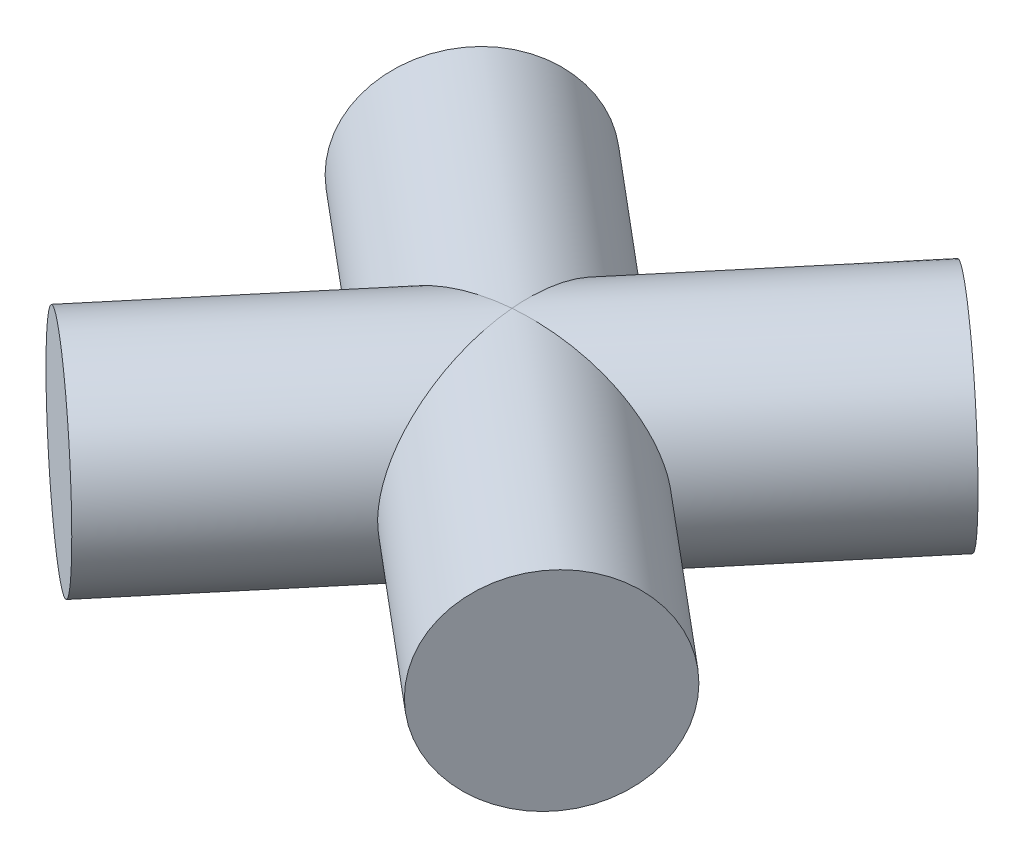
ISO-10303-21;
HEADER;
FILE_DESCRIPTION(('STEP AP214'),'2;1');
FILE_NAME('part.step','',(''),(''),'','','');
FILE_SCHEMA(('AUTOMOTIVE_DESIGN { 1 0 10303 214 1 1 1 1 }'));
ENDSEC;
DATA;
#1=APPLICATION_CONTEXT('core data for automotive mechanical design processes');
#2=APPLICATION_PROTOCOL_DEFINITION('international standard','automotive_design',2000,#1);
#3=PRODUCT_CONTEXT('',#1,'mechanical');
#4=PRODUCT('Part','Part','',(#3));
#5=PRODUCT_RELATED_PRODUCT_CATEGORY('part','',(#4));
#6=PRODUCT_DEFINITION_FORMATION('','',#4);
#7=PRODUCT_DEFINITION_CONTEXT('part definition',#1,'design');
#8=PRODUCT_DEFINITION('design','',#6,#7);
#9=PRODUCT_DEFINITION_SHAPE('','',#8);
#10=(LENGTH_UNIT() NAMED_UNIT(*) SI_UNIT(.MILLI.,.METRE.));
#11=(NAMED_UNIT(*) PLANE_ANGLE_UNIT() SI_UNIT($,.RADIAN.));
#12=(NAMED_UNIT(*) SI_UNIT($,.STERADIAN.) SOLID_ANGLE_UNIT());
#13=UNCERTAINTY_MEASURE_WITH_UNIT(LENGTH_MEASURE(1.E-05),#10,'distance_accuracy_value','');
#14=(GEOMETRIC_REPRESENTATION_CONTEXT(3) GLOBAL_UNCERTAINTY_ASSIGNED_CONTEXT((#13)) GLOBAL_UNIT_ASSIGNED_CONTEXT((#10,
#11,#12)) REPRESENTATION_CONTEXT('',''));
#15=CARTESIAN_POINT('',(0.,0.,0.));
#16=DIRECTION('',(0.,0.,1.));
#17=DIRECTION('',(1.,0.,0.));
#18=AXIS2_PLACEMENT_3D('',#15,#16,#17);
#19=CARTESIAN_POINT('',(-15.3208888623795,253.5,-12.8557521937308));
#20=DIRECTION('',(0.766044443118977,0.,0.64278760968654));
#21=DIRECTION('',(0.64278760968654,0.,-0.766044443118977));
#22=AXIS2_PLACEMENT_3D('',#19,#20,#21);
#23=CYLINDRICAL_SURFACE('',#22,6.5);
#24=CARTESIAN_POINT('',(15.3208888623795,253.5,12.8557521937308));
#25=DIRECTION('',(0.766044443118977,0.,0.64278760968654));
#26=DIRECTION('',(0.64278760968654,0.,-0.766044443118977));
#27=AXIS2_PLACEMENT_3D('',#24,#25,#26);
#28=CIRCLE('',#27,6.5);
#29=CARTESIAN_POINT('',(19.4990083253421,253.5,7.87646331345745));
#30=VERTEX_POINT('',#29);
#31=EDGE_CURVE('E72',#30,#30,#28,.T.);
#32=ORIENTED_EDGE('',*,*,#31,.F.);
#33=EDGE_LOOP('',(#32));
#34=FACE_BOUND('',#33,.T.);
#35=CARTESIAN_POINT('',(0.,253.5,0.));
#36=DIRECTION('',(0.0871557427476569,0.,0.996194698091746));
#37=DIRECTION('',(0.996194698091746,0.,-0.087155742747657));
#38=AXIS2_PLACEMENT_3D('',#35,#36,#37);
#39=ELLIPSE('',#38,9.19238815542512,6.50000000000001);
#40=CARTESIAN_POINT('',(0.,247.,0.));
#41=VERTEX_POINT('',#40);
#42=CARTESIAN_POINT('',(0.,260.,0.));
#43=VERTEX_POINT('',#42);
#44=EDGE_CURVE('E60',#41,#43,#39,.T.);
#45=ORIENTED_EDGE('',*,*,#44,.T.);
#46=CARTESIAN_POINT('',(0.,253.5,0.));
#47=DIRECTION('',(0.996194698091746,0.,-0.087155742747657));
#48=DIRECTION('',(0.0871557427476569,0.,0.996194698091746));
#49=AXIS2_PLACEMENT_3D('',#46,#47,#48);
#50=ELLIPSE('',#49,9.19238815542513,6.50000000000001);
#51=EDGE_CURVE('E49',#43,#41,#50,.T.);
#52=ORIENTED_EDGE('',*,*,#51,.T.);
#53=EDGE_LOOP('',(#45,#52));
#54=FACE_BOUND('',#53,.T.);
#55=ADVANCED_FACE('F41',(#34,#54),#23,.T.);
#56=CARTESIAN_POINT('',(15.3208888623795,253.5,12.8557521937308));
#57=DIRECTION('',(0.766044443118977,0.,0.64278760968654));
#58=DIRECTION('',(0.64278760968654,0.,-0.766044443118977));
#59=AXIS2_PLACEMENT_3D('',#56,#57,#58);
#60=PLANE('',#59);
#61=ORIENTED_EDGE('',*,*,#31,.T.);
#62=EDGE_LOOP('',(#61));
#63=FACE_BOUND('',#62,.T.);
#64=ADVANCED_FACE('F93',(#63),#60,.T.);
#65=CARTESIAN_POINT('',(-12.8557521937308,253.5,15.3208888623795));
#66=DIRECTION('',(-0.64278760968654,0.,0.766044443118977));
#67=DIRECTION('',(0.766044443118977,0.,0.64278760968654));
#68=AXIS2_PLACEMENT_3D('',#65,#66,#67);
#69=PLANE('',#68);
#70=CARTESIAN_POINT('',(-12.8557521937308,253.5,15.3208888623795));
#71=DIRECTION('',(-0.64278760968654,0.,0.766044443118977));
#72=DIRECTION('',(0.766044443118977,0.,0.64278760968654));
#73=AXIS2_PLACEMENT_3D('',#70,#71,#72);
#74=CIRCLE('',#73,6.50000000000001);
#75=CARTESIAN_POINT('',(-7.87646331345744,253.5,19.4990083253421));
#76=VERTEX_POINT('',#75);
#77=EDGE_CURVE('E75',#76,#76,#74,.T.);
#78=ORIENTED_EDGE('',*,*,#77,.T.);
#79=EDGE_LOOP('',(#78));
#80=FACE_BOUND('',#79,.T.);
#81=ADVANCED_FACE('F84',(#80),#69,.T.);
#82=CARTESIAN_POINT('',(-12.8557521937308,253.5,15.3208888623795));
#83=DIRECTION('',(0.64278760968654,0.,-0.766044443118977));
#84=DIRECTION('',(-0.766044443118977,0.,-0.64278760968654));
#85=AXIS2_PLACEMENT_3D('',#82,#83,#84);
#86=CYLINDRICAL_SURFACE('',#85,6.50000000000001);
#87=ORIENTED_EDGE('',*,*,#51,.F.);
#88=CARTESIAN_POINT('',(0.,253.5,0.));
#89=DIRECTION('',(0.0871557427476569,0.,0.996194698091746));
#90=DIRECTION('',(0.996194698091746,0.,-0.087155742747657));
#91=AXIS2_PLACEMENT_3D('',#88,#89,#90);
#92=ELLIPSE('',#91,9.19238815542512,6.50000000000001);
#93=EDGE_CURVE('E54',#41,#43,#92,.F.);
#94=ORIENTED_EDGE('',*,*,#93,.F.);
#95=EDGE_LOOP('',(#87,#94));
#96=FACE_BOUND('',#95,.T.);
#97=ORIENTED_EDGE('',*,*,#77,.F.);
#98=EDGE_LOOP('',(#97));
#99=FACE_BOUND('',#98,.T.);
#100=ADVANCED_FACE('F67',(#96,#99),#86,.T.);
#101=CARTESIAN_POINT('',(0.,253.5,0.));
#102=DIRECTION('',(0.996194698091746,0.,-0.087155742747657));
#103=DIRECTION('',(0.0871557427476569,0.,0.996194698091746));
#104=AXIS2_PLACEMENT_3D('',#101,#102,#103);
#105=ELLIPSE('',#104,9.19238815542513,6.50000000000001);
#106=EDGE_CURVE('E11',#43,#41,#105,.F.);
#107=ORIENTED_EDGE('',*,*,#106,.F.);
#108=ORIENTED_EDGE('',*,*,#44,.F.);
#109=EDGE_LOOP('',(#107,#108));
#110=FACE_BOUND('',#109,.T.);
#111=CARTESIAN_POINT('',(12.8557521937308,253.5,-15.3208888623795));
#112=DIRECTION('',(-0.64278760968654,0.,0.766044443118977));
#113=DIRECTION('',(0.766044443118977,0.,0.64278760968654));
#114=AXIS2_PLACEMENT_3D('',#111,#112,#113);
#115=CIRCLE('',#114,6.50000000000001);
#116=CARTESIAN_POINT('',(17.8350410740042,253.5,-11.142769399417));
#117=VERTEX_POINT('',#116);
#118=EDGE_CURVE('E78',#117,#117,#115,.T.);
#119=ORIENTED_EDGE('',*,*,#118,.T.);
#120=EDGE_LOOP('',(#119));
#121=FACE_BOUND('',#120,.T.);
#122=ADVANCED_FACE('F61',(#110,#121),#86,.T.);
#123=CARTESIAN_POINT('',(12.8557521937308,253.5,-15.3208888623795));
#124=DIRECTION('',(-0.64278760968654,0.,0.766044443118977));
#125=DIRECTION('',(0.766044443118977,0.,0.64278760968654));
#126=AXIS2_PLACEMENT_3D('',#123,#124,#125);
#127=PLANE('',#126);
#128=ORIENTED_EDGE('',*,*,#118,.F.);
#129=EDGE_LOOP('',(#128));
#130=FACE_BOUND('',#129,.T.);
#131=ADVANCED_FACE('F92',(#130),#127,.F.);
#132=CARTESIAN_POINT('',(-15.3208888623795,253.5,-12.8557521937308));
#133=DIRECTION('',(0.766044443118977,0.,0.64278760968654));
#134=DIRECTION('',(0.64278760968654,0.,-0.766044443118977));
#135=AXIS2_PLACEMENT_3D('',#132,#133,#134);
#136=PLANE('',#135);
#137=CARTESIAN_POINT('',(-15.3208888623795,253.5,-12.8557521937308));
#138=DIRECTION('',(0.766044443118977,0.,0.64278760968654));
#139=DIRECTION('',(0.64278760968654,0.,-0.766044443118977));
#140=AXIS2_PLACEMENT_3D('',#137,#138,#139);
#141=CIRCLE('',#140,6.5);
#142=CARTESIAN_POINT('',(-11.142769399417,253.5,-17.8350410740042));
#143=VERTEX_POINT('',#142);
#144=EDGE_CURVE('E69',#143,#143,#141,.T.);
#145=ORIENTED_EDGE('',*,*,#144,.F.);
#146=EDGE_LOOP('',(#145));
#147=FACE_BOUND('',#146,.T.);
#148=ADVANCED_FACE('F106',(#147),#136,.F.);
#149=ORIENTED_EDGE('',*,*,#144,.T.);
#150=EDGE_LOOP('',(#149));
#151=FACE_BOUND('',#150,.T.);
#152=ORIENTED_EDGE('',*,*,#93,.T.);
#153=ORIENTED_EDGE('',*,*,#106,.T.);
#154=EDGE_LOOP('',(#152,#153));
#155=FACE_BOUND('',#154,.T.);
#156=ADVANCED_FACE('F43',(#151,#155),#23,.T.);
#157=CLOSED_SHELL('',(#55,#64,#81,#100,#122,#131,#148,#156));
#158=MANIFOLD_SOLID_BREP('B2',#157);
#159=ADVANCED_BREP_SHAPE_REPRESENTATION('',(#18,#158),#14);
#160=SHAPE_DEFINITION_REPRESENTATION(#9,#159);
ENDSEC;
END-ISO-10303-21;
